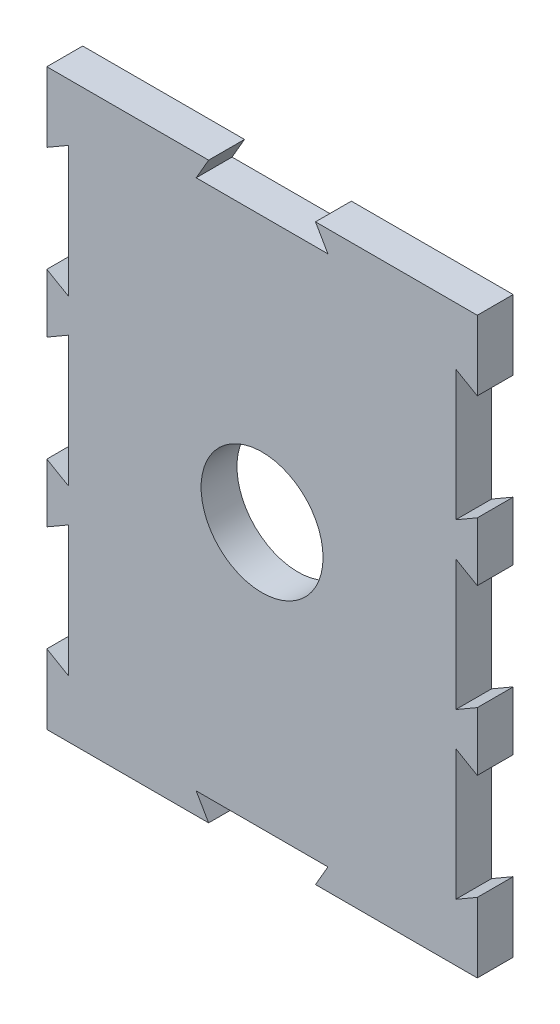
ISO-10303-21;
HEADER;
FILE_DESCRIPTION(('STEP AP214'),'2;1');
FILE_NAME('part.step','',(''),(''),'','','');
FILE_SCHEMA(('AUTOMOTIVE_DESIGN { 1 0 10303 214 1 1 1 1 }'));
ENDSEC;
DATA;
#1=APPLICATION_CONTEXT('core data for automotive mechanical design processes');
#2=APPLICATION_PROTOCOL_DEFINITION('international standard','automotive_design',2000,#1);
#3=PRODUCT_CONTEXT('',#1,'mechanical');
#4=PRODUCT('Part','Part','',(#3));
#5=PRODUCT_RELATED_PRODUCT_CATEGORY('part','',(#4));
#6=PRODUCT_DEFINITION_FORMATION('','',#4);
#7=PRODUCT_DEFINITION_CONTEXT('part definition',#1,'design');
#8=PRODUCT_DEFINITION('design','',#6,#7);
#9=PRODUCT_DEFINITION_SHAPE('','',#8);
#10=(LENGTH_UNIT() NAMED_UNIT(*) SI_UNIT(.MILLI.,.METRE.));
#11=(NAMED_UNIT(*) PLANE_ANGLE_UNIT() SI_UNIT($,.RADIAN.));
#12=(NAMED_UNIT(*) SI_UNIT($,.STERADIAN.) SOLID_ANGLE_UNIT());
#13=UNCERTAINTY_MEASURE_WITH_UNIT(LENGTH_MEASURE(1.E-05),#10,'distance_accuracy_value','');
#14=(GEOMETRIC_REPRESENTATION_CONTEXT(3) GLOBAL_UNCERTAINTY_ASSIGNED_CONTEXT((#13)) GLOBAL_UNIT_ASSIGNED_CONTEXT((#10,
#11,#12)) REPRESENTATION_CONTEXT('',''));
#15=CARTESIAN_POINT('',(0.,0.,0.));
#16=DIRECTION('',(0.,0.,1.));
#17=DIRECTION('',(1.,0.,0.));
#18=AXIS2_PLACEMENT_3D('',#15,#16,#17);
#19=CARTESIAN_POINT('',(22.9063719300984,-13.225,5.));
#20=DIRECTION('',(-0.866025403784439,0.5,0.));
#21=DIRECTION('',(-0.5,-0.866025403784439,0.));
#22=AXIS2_PLACEMENT_3D('',#19,#20,#21);
#23=PLANE('',#22);
#24=DIRECTION('',(0.5,0.866025403784439,0.));
#25=VECTOR('',#24,1.);
#26=CARTESIAN_POINT('',(22.9063719300984,-13.225,0.));
#27=LINE('',#26,#25);
#28=CARTESIAN_POINT('',(7.44781847254617,-40.,0.));
#29=VERTEX_POINT('',#28);
#30=CARTESIAN_POINT('',(9.17986928011505,-37.,0.));
#31=VERTEX_POINT('',#30);
#32=EDGE_CURVE('E309',#29,#31,#27,.T.);
#33=ORIENTED_EDGE('',*,*,#32,.F.);
#34=DIRECTION('',(0.,0.,-1.));
#35=VECTOR('',#34,1.);
#36=CARTESIAN_POINT('',(7.44781847254617,-40.,5.));
#37=LINE('',#36,#35);
#38=CARTESIAN_POINT('',(7.44781847254617,-40.,5.));
#39=VERTEX_POINT('',#38);
#40=EDGE_CURVE('E11',#39,#29,#37,.T.);
#41=ORIENTED_EDGE('',*,*,#40,.F.);
#42=DIRECTION('',(0.5,0.866025403784439,0.));
#43=VECTOR('',#42,1.);
#44=CARTESIAN_POINT('',(22.9063719300984,-13.225,5.));
#45=LINE('',#44,#43);
#46=CARTESIAN_POINT('',(9.17986928011505,-37.,5.));
#47=VERTEX_POINT('',#46);
#48=EDGE_CURVE('E892',#39,#47,#45,.T.);
#49=ORIENTED_EDGE('',*,*,#48,.T.);
#50=DIRECTION('',(0.,0.,-1.));
#51=VECTOR('',#50,1.);
#52=CARTESIAN_POINT('',(9.17986928011505,-37.,5.));
#53=LINE('',#52,#51);
#54=EDGE_CURVE('E58',#47,#31,#53,.T.);
#55=ORIENTED_EDGE('',*,*,#54,.T.);
#56=EDGE_LOOP('',(#33,#41,#49,#55));
#57=FACE_BOUND('',#56,.T.);
#58=ADVANCED_FACE('F41',(#57),#23,.T.);
#59=CARTESIAN_POINT('',(0.,-40.,5.));
#60=DIRECTION('',(0.,-1.,0.));
#61=DIRECTION('',(0.,0.,-1.));
#62=AXIS2_PLACEMENT_3D('',#59,#60,#61);
#63=PLANE('',#62);
#64=DIRECTION('',(-1.,0.,0.));
#65=VECTOR('',#64,1.);
#66=CARTESIAN_POINT('',(0.,-40.,0.));
#67=LINE('',#66,#65);
#68=CARTESIAN_POINT('',(30.,-40.,0.));
#69=VERTEX_POINT('',#68);
#70=EDGE_CURVE('E311',#69,#29,#67,.T.);
#71=ORIENTED_EDGE('',*,*,#70,.F.);
#72=DIRECTION('',(0.,0.,-1.));
#73=VECTOR('',#72,1.);
#74=CARTESIAN_POINT('',(30.,-40.,5.));
#75=LINE('',#74,#73);
#76=CARTESIAN_POINT('',(30.,-40.,5.));
#77=VERTEX_POINT('',#76);
#78=EDGE_CURVE('E50',#77,#69,#75,.T.);
#79=ORIENTED_EDGE('',*,*,#78,.F.);
#80=DIRECTION('',(-1.,0.,0.));
#81=VECTOR('',#80,1.);
#82=CARTESIAN_POINT('',(0.,-40.,5.));
#83=LINE('',#82,#81);
#84=EDGE_CURVE('E297',#77,#39,#83,.T.);
#85=ORIENTED_EDGE('',*,*,#84,.T.);
#86=ORIENTED_EDGE('',*,*,#40,.T.);
#87=EDGE_LOOP('',(#71,#79,#85,#86));
#88=FACE_BOUND('',#87,.T.);
#89=ADVANCED_FACE('F491',(#88),#63,.T.);
#90=CARTESIAN_POINT('',(30.,0.,5.));
#91=DIRECTION('',(-1.,0.,0.));
#92=DIRECTION('',(0.,0.,1.));
#93=AXIS2_PLACEMENT_3D('',#90,#91,#92);
#94=PLANE('',#93);
#95=DIRECTION('',(0.,1.,0.));
#96=VECTOR('',#95,1.);
#97=CARTESIAN_POINT('',(30.,0.,0.));
#98=LINE('',#97,#96);
#99=CARTESIAN_POINT('',(30.,-30.2679491924311,0.));
#100=VERTEX_POINT('',#99);
#101=EDGE_CURVE('E314',#69,#100,#98,.T.);
#102=ORIENTED_EDGE('',*,*,#101,.T.);
#103=DIRECTION('',(0.,0.,-1.));
#104=VECTOR('',#103,1.);
#105=CARTESIAN_POINT('',(30.,-30.2679491924311,5.));
#106=LINE('',#105,#104);
#107=CARTESIAN_POINT('',(30.,-30.2679491924311,5.));
#108=VERTEX_POINT('',#107);
#109=EDGE_CURVE('E476',#108,#100,#106,.T.);
#110=ORIENTED_EDGE('',*,*,#109,.F.);
#111=DIRECTION('',(0.,1.,0.));
#112=VECTOR('',#111,1.);
#113=CARTESIAN_POINT('',(30.,0.,5.));
#114=LINE('',#113,#112);
#115=EDGE_CURVE('E484',#77,#108,#114,.T.);
#116=ORIENTED_EDGE('',*,*,#115,.F.);
#117=ORIENTED_EDGE('',*,*,#78,.T.);
#118=EDGE_LOOP('',(#102,#110,#116,#117));
#119=FACE_BOUND('',#118,.T.);
#120=ADVANCED_FACE('F481',(#119),#94,.F.);
#121=CARTESIAN_POINT('',(20.606406460551,-35.6913429510899,5.));
#122=DIRECTION('',(0.5,-0.866025403784439,0.));
#123=DIRECTION('',(0.866025403784439,0.5,0.));
#124=AXIS2_PLACEMENT_3D('',#121,#122,#123);
#125=PLANE('',#124);
#126=DIRECTION('',(-0.866025403784439,-0.5,0.));
#127=VECTOR('',#126,1.);
#128=CARTESIAN_POINT('',(20.606406460551,-35.6913429510899,0.));
#129=LINE('',#128,#127);
#130=CARTESIAN_POINT('',(27.,-32.,0.));
#131=VERTEX_POINT('',#130);
#132=EDGE_CURVE('E317',#100,#131,#129,.T.);
#133=ORIENTED_EDGE('',*,*,#132,.T.);
#134=DIRECTION('',(0.,0.,-1.));
#135=VECTOR('',#134,1.);
#136=CARTESIAN_POINT('',(27.,-32.,5.));
#137=LINE('',#136,#135);
#138=CARTESIAN_POINT('',(27.,-32.,5.));
#139=VERTEX_POINT('',#138);
#140=EDGE_CURVE('E473',#139,#131,#137,.T.);
#141=ORIENTED_EDGE('',*,*,#140,.F.);
#142=DIRECTION('',(-0.866025403784439,-0.5,0.));
#143=VECTOR('',#142,1.);
#144=CARTESIAN_POINT('',(20.606406460551,-35.6913429510899,5.));
#145=LINE('',#144,#143);
#146=EDGE_CURVE('E889',#108,#139,#145,.T.);
#147=ORIENTED_EDGE('',*,*,#146,.F.);
#148=ORIENTED_EDGE('',*,*,#109,.T.);
#149=EDGE_LOOP('',(#133,#141,#147,#148));
#150=FACE_BOUND('',#149,.T.);
#151=ADVANCED_FACE('F510',(#150),#125,.F.);
#152=CARTESIAN_POINT('',(27.,0.,5.));
#153=DIRECTION('',(-1.,0.,0.));
#154=DIRECTION('',(0.,-1.,0.));
#155=AXIS2_PLACEMENT_3D('',#152,#153,#154);
#156=PLANE('',#155);
#157=DIRECTION('',(0.,1.,0.));
#158=VECTOR('',#157,1.);
#159=CARTESIAN_POINT('',(27.,0.,0.));
#160=LINE('',#159,#158);
#161=CARTESIAN_POINT('',(27.,-13.8134665205268,0.));
#162=VERTEX_POINT('',#161);
#163=EDGE_CURVE('E322',#131,#162,#160,.T.);
#164=ORIENTED_EDGE('',*,*,#163,.T.);
#165=DIRECTION('',(0.,0.,-1.));
#166=VECTOR('',#165,1.);
#167=CARTESIAN_POINT('',(27.,-13.8134665205268,5.));
#168=LINE('',#167,#166);
#169=CARTESIAN_POINT('',(27.,-13.8134665205268,5.));
#170=VERTEX_POINT('',#169);
#171=EDGE_CURVE('E470',#170,#162,#168,.T.);
#172=ORIENTED_EDGE('',*,*,#171,.F.);
#173=DIRECTION('',(0.,1.,0.));
#174=VECTOR('',#173,1.);
#175=CARTESIAN_POINT('',(27.,0.,5.));
#176=LINE('',#175,#174);
#177=EDGE_CURVE('E891',#139,#170,#176,.T.);
#178=ORIENTED_EDGE('',*,*,#177,.F.);
#179=ORIENTED_EDGE('',*,*,#140,.T.);
#180=EDGE_LOOP('',(#164,#172,#178,#179));
#181=FACE_BOUND('',#180,.T.);
#182=ADVANCED_FACE('F513',(#181),#156,.F.);
#183=CARTESIAN_POINT('',(0.768593539448988,1.33124306069484,5.));
#184=DIRECTION('',(0.5,0.866025403784439,0.));
#185=DIRECTION('',(-0.866025403784439,0.5,0.));
#186=AXIS2_PLACEMENT_3D('',#183,#184,#185);
#187=PLANE('',#186);
#188=DIRECTION('',(0.866025403784439,-0.5,0.));
#189=VECTOR('',#188,1.);
#190=CARTESIAN_POINT('',(0.768593539448988,1.33124306069484,0.));
#191=LINE('',#190,#189);
#192=CARTESIAN_POINT('',(30.,-15.5455173280957,0.));
#193=VERTEX_POINT('',#192);
#194=EDGE_CURVE('E325',#162,#193,#191,.T.);
#195=ORIENTED_EDGE('',*,*,#194,.T.);
#196=DIRECTION('',(0.,0.,-1.));
#197=VECTOR('',#196,1.);
#198=CARTESIAN_POINT('',(30.,-15.5455173280957,5.));
#199=LINE('',#198,#197);
#200=CARTESIAN_POINT('',(30.,-15.5455173280957,5.));
#201=VERTEX_POINT('',#200);
#202=EDGE_CURVE('E467',#201,#193,#199,.T.);
#203=ORIENTED_EDGE('',*,*,#202,.F.);
#204=DIRECTION('',(0.866025403784439,-0.5,0.));
#205=VECTOR('',#204,1.);
#206=CARTESIAN_POINT('',(0.768593539448988,1.33124306069484,5.));
#207=LINE('',#206,#205);
#208=EDGE_CURVE('E895',#170,#201,#207,.T.);
#209=ORIENTED_EDGE('',*,*,#208,.F.);
#210=ORIENTED_EDGE('',*,*,#171,.T.);
#211=EDGE_LOOP('',(#195,#203,#209,#210));
#212=FACE_BOUND('',#211,.T.);
#213=ADVANCED_FACE('F517',(#212),#187,.F.);
#214=CARTESIAN_POINT('',(30.,-7.36121593216774,0.));
#215=VERTEX_POINT('',#214);
#216=EDGE_CURVE('E319',#193,#215,#98,.T.);
#217=ORIENTED_EDGE('',*,*,#216,.T.);
#218=DIRECTION('',(0.,0.,-1.));
#219=VECTOR('',#218,1.);
#220=CARTESIAN_POINT('',(30.,-7.36121593216774,5.));
#221=LINE('',#220,#219);
#222=CARTESIAN_POINT('',(30.,-7.36121593216774,5.));
#223=VERTEX_POINT('',#222);
#224=EDGE_CURVE('E464',#223,#215,#221,.T.);
#225=ORIENTED_EDGE('',*,*,#224,.F.);
#226=EDGE_CURVE('E888',#201,#223,#114,.T.);
#227=ORIENTED_EDGE('',*,*,#226,.F.);
#228=ORIENTED_EDGE('',*,*,#202,.T.);
#229=EDGE_LOOP('',(#217,#225,#227,#228));
#230=FACE_BOUND('',#229,.T.);
#231=ADVANCED_FACE('F521',(#230),#94,.F.);
#232=CARTESIAN_POINT('',(10.6875,-18.5112930058924,5.));
#233=DIRECTION('',(0.5,-0.866025403784439,0.));
#234=DIRECTION('',(0.866025403784439,0.5,0.));
#235=AXIS2_PLACEMENT_3D('',#232,#233,#234);
#236=PLANE('',#235);
#237=DIRECTION('',(-0.866025403784439,-0.5,0.));
#238=VECTOR('',#237,1.);
#239=CARTESIAN_POINT('',(10.6875,-18.5112930058924,0.));
#240=LINE('',#239,#238);
#241=CARTESIAN_POINT('',(27.,-9.09326673973662,0.));
#242=VERTEX_POINT('',#241);
#243=EDGE_CURVE('E328',#215,#242,#240,.T.);
#244=ORIENTED_EDGE('',*,*,#243,.T.);
#245=DIRECTION('',(0.,0.,-1.));
#246=VECTOR('',#245,1.);
#247=CARTESIAN_POINT('',(27.,-9.09326673973662,5.));
#248=LINE('',#247,#246);
#249=CARTESIAN_POINT('',(27.,-9.09326673973662,5.));
#250=VERTEX_POINT('',#249);
#251=EDGE_CURVE('E461',#250,#242,#248,.T.);
#252=ORIENTED_EDGE('',*,*,#251,.F.);
#253=DIRECTION('',(-0.866025403784439,-0.5,0.));
#254=VECTOR('',#253,1.);
#255=CARTESIAN_POINT('',(10.6875,-18.5112930058924,5.));
#256=LINE('',#255,#254);
#257=EDGE_CURVE('E894',#223,#250,#256,.T.);
#258=ORIENTED_EDGE('',*,*,#257,.F.);
#259=ORIENTED_EDGE('',*,*,#224,.T.);
#260=EDGE_LOOP('',(#244,#252,#258,#259));
#261=FACE_BOUND('',#260,.T.);
#262=ADVANCED_FACE('F523',(#261),#236,.F.);
#263=CARTESIAN_POINT('',(27.,0.,5.));
#264=DIRECTION('',(-1.,0.,0.));
#265=DIRECTION('',(0.,-1.,0.));
#266=AXIS2_PLACEMENT_3D('',#263,#264,#265);
#267=PLANE('',#266);
#268=DIRECTION('',(0.,1.,0.));
#269=VECTOR('',#268,1.);
#270=CARTESIAN_POINT('',(27.,0.,0.));
#271=LINE('',#270,#269);
#272=CARTESIAN_POINT('',(27.,9.0932667397366,0.));
#273=VERTEX_POINT('',#272);
#274=EDGE_CURVE('E331',#242,#273,#271,.T.);
#275=ORIENTED_EDGE('',*,*,#274,.T.);
#276=DIRECTION('',(0.,0.,-1.));
#277=VECTOR('',#276,1.);
#278=CARTESIAN_POINT('',(27.,9.0932667397366,5.));
#279=LINE('',#278,#277);
#280=CARTESIAN_POINT('',(27.,9.0932667397366,5.));
#281=VERTEX_POINT('',#280);
#282=EDGE_CURVE('E458',#281,#273,#279,.T.);
#283=ORIENTED_EDGE('',*,*,#282,.F.);
#284=DIRECTION('',(0.,1.,0.));
#285=VECTOR('',#284,1.);
#286=CARTESIAN_POINT('',(27.,0.,5.));
#287=LINE('',#286,#285);
#288=EDGE_CURVE('E898',#250,#281,#287,.T.);
#289=ORIENTED_EDGE('',*,*,#288,.F.);
#290=ORIENTED_EDGE('',*,*,#251,.T.);
#291=EDGE_LOOP('',(#275,#283,#289,#290));
#292=FACE_BOUND('',#291,.T.);
#293=ADVANCED_FACE('F526',(#292),#267,.F.);
#294=CARTESIAN_POINT('',(10.6875,18.5112930058924,5.));
#295=DIRECTION('',(0.5,0.866025403784439,0.));
#296=DIRECTION('',(-0.866025403784439,0.5,0.));
#297=AXIS2_PLACEMENT_3D('',#294,#295,#296);
#298=PLANE('',#297);
#299=DIRECTION('',(0.866025403784439,-0.5,0.));
#300=VECTOR('',#299,1.);
#301=CARTESIAN_POINT('',(10.6875,18.5112930058924,0.));
#302=LINE('',#301,#300);
#303=CARTESIAN_POINT('',(30.,7.36121593216772,0.));
#304=VERTEX_POINT('',#303);
#305=EDGE_CURVE('E334',#273,#304,#302,.T.);
#306=ORIENTED_EDGE('',*,*,#305,.T.);
#307=DIRECTION('',(0.,0.,-1.));
#308=VECTOR('',#307,1.);
#309=CARTESIAN_POINT('',(30.,7.36121593216772,5.));
#310=LINE('',#309,#308);
#311=CARTESIAN_POINT('',(30.,7.36121593216772,5.));
#312=VERTEX_POINT('',#311);
#313=EDGE_CURVE('E455',#312,#304,#310,.T.);
#314=ORIENTED_EDGE('',*,*,#313,.F.);
#315=DIRECTION('',(0.866025403784439,-0.5,0.));
#316=VECTOR('',#315,1.);
#317=CARTESIAN_POINT('',(10.6875,18.5112930058924,5.));
#318=LINE('',#317,#316);
#319=EDGE_CURVE('E887',#281,#312,#318,.T.);
#320=ORIENTED_EDGE('',*,*,#319,.F.);
#321=ORIENTED_EDGE('',*,*,#282,.T.);
#322=EDGE_LOOP('',(#306,#314,#320,#321));
#323=FACE_BOUND('',#322,.T.);
#324=ADVANCED_FACE('F530',(#323),#298,.F.);
#325=CARTESIAN_POINT('',(30.,15.5455173280956,0.));
#326=VERTEX_POINT('',#325);
#327=EDGE_CURVE('E337',#304,#326,#98,.T.);
#328=ORIENTED_EDGE('',*,*,#327,.T.);
#329=DIRECTION('',(0.,0.,-1.));
#330=VECTOR('',#329,1.);
#331=CARTESIAN_POINT('',(30.,15.5455173280956,5.));
#332=LINE('',#331,#330);
#333=CARTESIAN_POINT('',(30.,15.5455173280956,5.));
#334=VERTEX_POINT('',#333);
#335=EDGE_CURVE('E452',#334,#326,#332,.T.);
#336=ORIENTED_EDGE('',*,*,#335,.F.);
#337=EDGE_CURVE('E881',#312,#334,#114,.T.);
#338=ORIENTED_EDGE('',*,*,#337,.F.);
#339=ORIENTED_EDGE('',*,*,#313,.T.);
#340=EDGE_LOOP('',(#328,#336,#338,#339));
#341=FACE_BOUND('',#340,.T.);
#342=ADVANCED_FACE('F534',(#341),#94,.F.);
#343=CARTESIAN_POINT('',(0.768593539448999,-1.33124306069486,5.));
#344=DIRECTION('',(0.5,-0.866025403784439,0.));
#345=DIRECTION('',(0.866025403784439,0.5,0.));
#346=AXIS2_PLACEMENT_3D('',#343,#344,#345);
#347=PLANE('',#346);
#348=DIRECTION('',(-0.866025403784439,-0.5,0.));
#349=VECTOR('',#348,1.);
#350=CARTESIAN_POINT('',(0.768593539448999,-1.33124306069486,0.));
#351=LINE('',#350,#349);
#352=CARTESIAN_POINT('',(27.,13.8134665205267,0.));
#353=VERTEX_POINT('',#352);
#354=EDGE_CURVE('E338',#326,#353,#351,.T.);
#355=ORIENTED_EDGE('',*,*,#354,.T.);
#356=DIRECTION('',(0.,0.,-1.));
#357=VECTOR('',#356,1.);
#358=CARTESIAN_POINT('',(27.,13.8134665205267,5.));
#359=LINE('',#358,#357);
#360=CARTESIAN_POINT('',(27.,13.8134665205267,5.));
#361=VERTEX_POINT('',#360);
#362=EDGE_CURVE('E449',#361,#353,#359,.T.);
#363=ORIENTED_EDGE('',*,*,#362,.F.);
#364=DIRECTION('',(-0.866025403784439,-0.5,0.));
#365=VECTOR('',#364,1.);
#366=CARTESIAN_POINT('',(0.768593539448999,-1.33124306069486,5.));
#367=LINE('',#366,#365);
#368=EDGE_CURVE('E886',#334,#361,#367,.T.);
#369=ORIENTED_EDGE('',*,*,#368,.F.);
#370=ORIENTED_EDGE('',*,*,#335,.T.);
#371=EDGE_LOOP('',(#355,#363,#369,#370));
#372=FACE_BOUND('',#371,.T.);
#373=ADVANCED_FACE('F536',(#372),#347,.F.);
#374=CARTESIAN_POINT('',(27.,0.,5.));
#375=DIRECTION('',(-1.,0.,0.));
#376=DIRECTION('',(0.,-1.,0.));
#377=AXIS2_PLACEMENT_3D('',#374,#375,#376);
#378=PLANE('',#377);
#379=DIRECTION('',(0.,1.,0.));
#380=VECTOR('',#379,1.);
#381=CARTESIAN_POINT('',(27.,0.,0.));
#382=LINE('',#381,#380);
#383=CARTESIAN_POINT('',(27.,32.,0.));
#384=VERTEX_POINT('',#383);
#385=EDGE_CURVE('E341',#353,#384,#382,.T.);
#386=ORIENTED_EDGE('',*,*,#385,.T.);
#387=DIRECTION('',(0.,0.,-1.));
#388=VECTOR('',#387,1.);
#389=CARTESIAN_POINT('',(27.,32.,5.));
#390=LINE('',#389,#388);
#391=CARTESIAN_POINT('',(27.,32.,5.));
#392=VERTEX_POINT('',#391);
#393=EDGE_CURVE('E446',#392,#384,#390,.T.);
#394=ORIENTED_EDGE('',*,*,#393,.F.);
#395=DIRECTION('',(0.,1.,0.));
#396=VECTOR('',#395,1.);
#397=CARTESIAN_POINT('',(27.,0.,5.));
#398=LINE('',#397,#396);
#399=EDGE_CURVE('E882',#361,#392,#398,.T.);
#400=ORIENTED_EDGE('',*,*,#399,.F.);
#401=ORIENTED_EDGE('',*,*,#362,.T.);
#402=EDGE_LOOP('',(#386,#394,#400,#401));
#403=FACE_BOUND('',#402,.T.);
#404=ADVANCED_FACE('F539',(#403),#378,.F.);
#405=CARTESIAN_POINT('',(20.6064064605511,35.6913429510899,5.));
#406=DIRECTION('',(0.500000000000001,0.866025403784438,0.));
#407=DIRECTION('',(-0.866025403784438,0.500000000000001,0.));
#408=AXIS2_PLACEMENT_3D('',#405,#406,#407);
#409=PLANE('',#408);
#410=DIRECTION('',(0.866025403784438,-0.500000000000001,0.));
#411=VECTOR('',#410,1.);
#412=CARTESIAN_POINT('',(20.6064064605511,35.6913429510899,0.));
#413=LINE('',#412,#411);
#414=CARTESIAN_POINT('',(30.,30.2679491924311,0.));
#415=VERTEX_POINT('',#414);
#416=EDGE_CURVE('E344',#384,#415,#413,.T.);
#417=ORIENTED_EDGE('',*,*,#416,.T.);
#418=DIRECTION('',(0.,0.,-1.));
#419=VECTOR('',#418,1.);
#420=CARTESIAN_POINT('',(30.,30.2679491924311,5.));
#421=LINE('',#420,#419);
#422=CARTESIAN_POINT('',(30.,30.2679491924311,5.));
#423=VERTEX_POINT('',#422);
#424=EDGE_CURVE('E443',#423,#415,#421,.T.);
#425=ORIENTED_EDGE('',*,*,#424,.F.);
#426=DIRECTION('',(0.866025403784438,-0.500000000000001,0.));
#427=VECTOR('',#426,1.);
#428=CARTESIAN_POINT('',(20.6064064605511,35.6913429510899,5.));
#429=LINE('',#428,#427);
#430=EDGE_CURVE('E879',#392,#423,#429,.T.);
#431=ORIENTED_EDGE('',*,*,#430,.F.);
#432=ORIENTED_EDGE('',*,*,#393,.T.);
#433=EDGE_LOOP('',(#417,#425,#431,#432));
#434=FACE_BOUND('',#433,.T.);
#435=ADVANCED_FACE('F543',(#434),#409,.F.);
#436=CARTESIAN_POINT('',(30.,40.,0.));
#437=VERTEX_POINT('',#436);
#438=EDGE_CURVE('E318',#415,#437,#98,.T.);
#439=ORIENTED_EDGE('',*,*,#438,.T.);
#440=DIRECTION('',(0.,0.,-1.));
#441=VECTOR('',#440,1.);
#442=CARTESIAN_POINT('',(30.,40.,5.));
#443=LINE('',#442,#441);
#444=CARTESIAN_POINT('',(30.,40.,5.));
#445=VERTEX_POINT('',#444);
#446=EDGE_CURVE('E440',#445,#437,#443,.T.);
#447=ORIENTED_EDGE('',*,*,#446,.F.);
#448=EDGE_CURVE('E874',#423,#445,#114,.T.);
#449=ORIENTED_EDGE('',*,*,#448,.F.);
#450=ORIENTED_EDGE('',*,*,#424,.T.);
#451=EDGE_LOOP('',(#439,#447,#449,#450));
#452=FACE_BOUND('',#451,.T.);
#453=ADVANCED_FACE('F547',(#452),#94,.F.);
#454=CARTESIAN_POINT('',(0.,40.,5.));
#455=DIRECTION('',(0.,-1.,0.));
#456=DIRECTION('',(1.,0.,0.));
#457=AXIS2_PLACEMENT_3D('',#454,#455,#456);
#458=PLANE('',#457);
#459=DIRECTION('',(-1.,0.,0.));
#460=VECTOR('',#459,1.);
#461=CARTESIAN_POINT('',(0.,40.,0.));
#462=LINE('',#461,#460);
#463=CARTESIAN_POINT('',(7.44781847254617,40.,0.));
#464=VERTEX_POINT('',#463);
#465=EDGE_CURVE('E347',#437,#464,#462,.T.);
#466=ORIENTED_EDGE('',*,*,#465,.T.);
#467=DIRECTION('',(0.,0.,-1.));
#468=VECTOR('',#467,1.);
#469=CARTESIAN_POINT('',(7.44781847254617,40.,5.));
#470=LINE('',#469,#468);
#471=CARTESIAN_POINT('',(7.44781847254617,40.,5.));
#472=VERTEX_POINT('',#471);
#473=EDGE_CURVE('E437',#472,#464,#470,.T.);
#474=ORIENTED_EDGE('',*,*,#473,.F.);
#475=DIRECTION('',(-1.,0.,0.));
#476=VECTOR('',#475,1.);
#477=CARTESIAN_POINT('',(0.,40.,5.));
#478=LINE('',#477,#476);
#479=EDGE_CURVE('E870',#445,#472,#478,.T.);
#480=ORIENTED_EDGE('',*,*,#479,.F.);
#481=ORIENTED_EDGE('',*,*,#446,.T.);
#482=EDGE_LOOP('',(#466,#474,#480,#481));
#483=FACE_BOUND('',#482,.T.);
#484=ADVANCED_FACE('F551',(#483),#458,.F.);
#485=CARTESIAN_POINT('',(22.9063719300984,13.225,5.));
#486=DIRECTION('',(0.866025403784439,0.5,0.));
#487=DIRECTION('',(-0.5,0.866025403784439,0.));
#488=AXIS2_PLACEMENT_3D('',#485,#486,#487);
#489=PLANE('',#488);
#490=DIRECTION('',(0.5,-0.866025403784439,0.));
#491=VECTOR('',#490,1.);
#492=CARTESIAN_POINT('',(22.9063719300984,13.225,0.));
#493=LINE('',#492,#491);
#494=CARTESIAN_POINT('',(9.17986928011505,37.,0.));
#495=VERTEX_POINT('',#494);
#496=EDGE_CURVE('E350',#464,#495,#493,.T.);
#497=ORIENTED_EDGE('',*,*,#496,.T.);
#498=DIRECTION('',(0.,0.,-1.));
#499=VECTOR('',#498,1.);
#500=CARTESIAN_POINT('',(9.17986928011505,37.,5.));
#501=LINE('',#500,#499);
#502=CARTESIAN_POINT('',(9.17986928011505,37.,5.));
#503=VERTEX_POINT('',#502);
#504=EDGE_CURVE('E434',#503,#495,#501,.T.);
#505=ORIENTED_EDGE('',*,*,#504,.F.);
#506=DIRECTION('',(0.5,-0.866025403784439,0.));
#507=VECTOR('',#506,1.);
#508=CARTESIAN_POINT('',(22.9063719300984,13.225,5.));
#509=LINE('',#508,#507);
#510=EDGE_CURVE('E873',#472,#503,#509,.T.);
#511=ORIENTED_EDGE('',*,*,#510,.F.);
#512=ORIENTED_EDGE('',*,*,#473,.T.);
#513=EDGE_LOOP('',(#497,#505,#511,#512));
#514=FACE_BOUND('',#513,.T.);
#515=ADVANCED_FACE('F553',(#514),#489,.F.);
#516=CARTESIAN_POINT('',(0.,37.,5.));
#517=DIRECTION('',(0.,-1.,0.));
#518=DIRECTION('',(0.,0.,-1.));
#519=AXIS2_PLACEMENT_3D('',#516,#517,#518);
#520=PLANE('',#519);
#521=DIRECTION('',(-1.,0.,0.));
#522=VECTOR('',#521,1.);
#523=CARTESIAN_POINT('',(0.,37.,0.));
#524=LINE('',#523,#522);
#525=CARTESIAN_POINT('',(-9.17986928011505,37.,0.));
#526=VERTEX_POINT('',#525);
#527=EDGE_CURVE('E354',#495,#526,#524,.T.);
#528=ORIENTED_EDGE('',*,*,#527,.T.);
#529=DIRECTION('',(0.,0.,-1.));
#530=VECTOR('',#529,1.);
#531=CARTESIAN_POINT('',(-9.17986928011505,37.,5.));
#532=LINE('',#531,#530);
#533=CARTESIAN_POINT('',(-9.17986928011505,37.,5.));
#534=VERTEX_POINT('',#533);
#535=EDGE_CURVE('E431',#534,#526,#532,.T.);
#536=ORIENTED_EDGE('',*,*,#535,.F.);
#537=DIRECTION('',(-1.,0.,0.));
#538=VECTOR('',#537,1.);
#539=CARTESIAN_POINT('',(0.,37.,5.));
#540=LINE('',#539,#538);
#541=EDGE_CURVE('E912',#503,#534,#540,.T.);
#542=ORIENTED_EDGE('',*,*,#541,.F.);
#543=ORIENTED_EDGE('',*,*,#504,.T.);
#544=EDGE_LOOP('',(#528,#536,#542,#543));
#545=FACE_BOUND('',#544,.T.);
#546=ADVANCED_FACE('F556',(#545),#520,.F.);
#547=CARTESIAN_POINT('',(-22.9063719300984,13.225,5.));
#548=DIRECTION('',(-0.866025403784439,0.5,0.));
#549=DIRECTION('',(-0.5,-0.866025403784439,0.));
#550=AXIS2_PLACEMENT_3D('',#547,#548,#549);
#551=PLANE('',#550);
#552=DIRECTION('',(0.5,0.866025403784439,0.));
#553=VECTOR('',#552,1.);
#554=CARTESIAN_POINT('',(-22.9063719300984,13.225,0.));
#555=LINE('',#554,#553);
#556=CARTESIAN_POINT('',(-7.44781847254616,40.,0.));
#557=VERTEX_POINT('',#556);
#558=EDGE_CURVE('E357',#526,#557,#555,.T.);
#559=ORIENTED_EDGE('',*,*,#558,.T.);
#560=DIRECTION('',(0.,0.,-1.));
#561=VECTOR('',#560,1.);
#562=CARTESIAN_POINT('',(-7.44781847254616,40.,5.));
#563=LINE('',#562,#561);
#564=CARTESIAN_POINT('',(-7.44781847254616,40.,5.));
#565=VERTEX_POINT('',#564);
#566=EDGE_CURVE('E428',#565,#557,#563,.T.);
#567=ORIENTED_EDGE('',*,*,#566,.F.);
#568=DIRECTION('',(0.5,0.866025403784439,0.));
#569=VECTOR('',#568,1.);
#570=CARTESIAN_POINT('',(-22.9063719300984,13.225,5.));
#571=LINE('',#570,#569);
#572=EDGE_CURVE('E915',#534,#565,#571,.T.);
#573=ORIENTED_EDGE('',*,*,#572,.F.);
#574=ORIENTED_EDGE('',*,*,#535,.T.);
#575=EDGE_LOOP('',(#559,#567,#573,#574));
#576=FACE_BOUND('',#575,.T.);
#577=ADVANCED_FACE('F560',(#576),#551,.F.);
#578=CARTESIAN_POINT('',(-30.,40.,0.));
#579=VERTEX_POINT('',#578);
#580=EDGE_CURVE('E351',#557,#579,#462,.T.);
#581=ORIENTED_EDGE('',*,*,#580,.T.);
#582=DIRECTION('',(0.,0.,-1.));
#583=VECTOR('',#582,1.);
#584=CARTESIAN_POINT('',(-30.,40.,5.));
#585=LINE('',#584,#583);
#586=CARTESIAN_POINT('',(-30.,40.,5.));
#587=VERTEX_POINT('',#586);
#588=EDGE_CURVE('E426',#587,#579,#585,.T.);
#589=ORIENTED_EDGE('',*,*,#588,.F.);
#590=EDGE_CURVE('E876',#565,#587,#478,.T.);
#591=ORIENTED_EDGE('',*,*,#590,.F.);
#592=ORIENTED_EDGE('',*,*,#566,.T.);
#593=EDGE_LOOP('',(#581,#589,#591,#592));
#594=FACE_BOUND('',#593,.T.);
#595=ADVANCED_FACE('F564',(#594),#458,.F.);
#596=CARTESIAN_POINT('',(-30.,0.,5.));
#597=DIRECTION('',(-1.,0.,0.));
#598=DIRECTION('',(0.,0.,1.));
#599=AXIS2_PLACEMENT_3D('',#596,#597,#598);
#600=PLANE('',#599);
#601=DIRECTION('',(0.,1.,0.));
#602=VECTOR('',#601,1.);
#603=CARTESIAN_POINT('',(-30.,0.,0.));
#604=LINE('',#603,#602);
#605=CARTESIAN_POINT('',(-30.,30.2679491924311,0.));
#606=VERTEX_POINT('',#605);
#607=EDGE_CURVE('E360',#606,#579,#604,.T.);
#608=ORIENTED_EDGE('',*,*,#607,.F.);
#609=DIRECTION('',(0.,0.,-1.));
#610=VECTOR('',#609,1.);
#611=CARTESIAN_POINT('',(-30.,30.2679491924311,5.));
#612=LINE('',#611,#610);
#613=CARTESIAN_POINT('',(-30.,30.2679491924311,5.));
#614=VERTEX_POINT('',#613);
#615=EDGE_CURVE('E424',#614,#606,#612,.T.);
#616=ORIENTED_EDGE('',*,*,#615,.F.);
#617=DIRECTION('',(0.,1.,0.));
#618=VECTOR('',#617,1.);
#619=CARTESIAN_POINT('',(-30.,0.,5.));
#620=LINE('',#619,#618);
#621=EDGE_CURVE('E918',#614,#587,#620,.T.);
#622=ORIENTED_EDGE('',*,*,#621,.T.);
#623=ORIENTED_EDGE('',*,*,#588,.T.);
#624=EDGE_LOOP('',(#608,#616,#622,#623));
#625=FACE_BOUND('',#624,.T.);
#626=ADVANCED_FACE('F568',(#625),#600,.T.);
#627=CARTESIAN_POINT('',(-20.6064064605511,35.6913429510899,5.));
#628=DIRECTION('',(0.500000000000001,-0.866025403784438,0.));
#629=DIRECTION('',(0.866025403784438,0.500000000000001,0.));
#630=AXIS2_PLACEMENT_3D('',#627,#628,#629);
#631=PLANE('',#630);
#632=DIRECTION('',(-0.866025403784438,-0.500000000000001,0.));
#633=VECTOR('',#632,1.);
#634=CARTESIAN_POINT('',(-20.6064064605511,35.6913429510899,0.));
#635=LINE('',#634,#633);
#636=CARTESIAN_POINT('',(-27.,32.,0.));
#637=VERTEX_POINT('',#636);
#638=EDGE_CURVE('E363',#637,#606,#635,.T.);
#639=ORIENTED_EDGE('',*,*,#638,.F.);
#640=DIRECTION('',(0.,0.,-1.));
#641=VECTOR('',#640,1.);
#642=CARTESIAN_POINT('',(-27.,32.,5.));
#643=LINE('',#642,#641);
#644=CARTESIAN_POINT('',(-27.,32.,5.));
#645=VERTEX_POINT('',#644);
#646=EDGE_CURVE('E422',#645,#637,#643,.T.);
#647=ORIENTED_EDGE('',*,*,#646,.F.);
#648=DIRECTION('',(-0.866025403784438,-0.500000000000001,0.));
#649=VECTOR('',#648,1.);
#650=CARTESIAN_POINT('',(-20.6064064605511,35.6913429510899,5.));
#651=LINE('',#650,#649);
#652=EDGE_CURVE('E921',#645,#614,#651,.T.);
#653=ORIENTED_EDGE('',*,*,#652,.T.);
#654=ORIENTED_EDGE('',*,*,#615,.T.);
#655=EDGE_LOOP('',(#639,#647,#653,#654));
#656=FACE_BOUND('',#655,.T.);
#657=ADVANCED_FACE('F570',(#656),#631,.T.);
#658=CARTESIAN_POINT('',(-27.,0.,5.));
#659=DIRECTION('',(-1.,0.,0.));
#660=DIRECTION('',(0.,-1.,0.));
#661=AXIS2_PLACEMENT_3D('',#658,#659,#660);
#662=PLANE('',#661);
#663=DIRECTION('',(0.,1.,0.));
#664=VECTOR('',#663,1.);
#665=CARTESIAN_POINT('',(-27.,0.,0.));
#666=LINE('',#665,#664);
#667=CARTESIAN_POINT('',(-27.,13.8134665205268,0.));
#668=VERTEX_POINT('',#667);
#669=EDGE_CURVE('E368',#668,#637,#666,.T.);
#670=ORIENTED_EDGE('',*,*,#669,.F.);
#671=DIRECTION('',(0.,0.,-1.));
#672=VECTOR('',#671,1.);
#673=CARTESIAN_POINT('',(-27.,13.8134665205268,5.));
#674=LINE('',#673,#672);
#675=CARTESIAN_POINT('',(-27.,13.8134665205268,5.));
#676=VERTEX_POINT('',#675);
#677=EDGE_CURVE('E420',#676,#668,#674,.T.);
#678=ORIENTED_EDGE('',*,*,#677,.F.);
#679=DIRECTION('',(0.,1.,0.));
#680=VECTOR('',#679,1.);
#681=CARTESIAN_POINT('',(-27.,0.,5.));
#682=LINE('',#681,#680);
#683=EDGE_CURVE('E925',#676,#645,#682,.T.);
#684=ORIENTED_EDGE('',*,*,#683,.T.);
#685=ORIENTED_EDGE('',*,*,#646,.T.);
#686=EDGE_LOOP('',(#670,#678,#684,#685));
#687=FACE_BOUND('',#686,.T.);
#688=ADVANCED_FACE('F573',(#687),#662,.T.);
#689=CARTESIAN_POINT('',(-0.768593539448999,-1.33124306069486,5.));
#690=DIRECTION('',(0.5,0.866025403784439,0.));
#691=DIRECTION('',(-0.866025403784439,0.5,0.));
#692=AXIS2_PLACEMENT_3D('',#689,#690,#691);
#693=PLANE('',#692);
#694=DIRECTION('',(0.866025403784439,-0.5,0.));
#695=VECTOR('',#694,1.);
#696=CARTESIAN_POINT('',(-0.768593539448999,-1.33124306069486,0.));
#697=LINE('',#696,#695);
#698=CARTESIAN_POINT('',(-30.,15.5455173280956,0.));
#699=VERTEX_POINT('',#698);
#700=EDGE_CURVE('E371',#699,#668,#697,.T.);
#701=ORIENTED_EDGE('',*,*,#700,.F.);
#702=DIRECTION('',(0.,0.,-1.));
#703=VECTOR('',#702,1.);
#704=CARTESIAN_POINT('',(-30.,15.5455173280956,5.));
#705=LINE('',#704,#703);
#706=CARTESIAN_POINT('',(-30.,15.5455173280956,5.));
#707=VERTEX_POINT('',#706);
#708=EDGE_CURVE('E418',#707,#699,#705,.T.);
#709=ORIENTED_EDGE('',*,*,#708,.F.);
#710=DIRECTION('',(0.866025403784439,-0.5,0.));
#711=VECTOR('',#710,1.);
#712=CARTESIAN_POINT('',(-0.768593539448999,-1.33124306069486,5.));
#713=LINE('',#712,#711);
#714=EDGE_CURVE('E928',#707,#676,#713,.T.);
#715=ORIENTED_EDGE('',*,*,#714,.T.);
#716=ORIENTED_EDGE('',*,*,#677,.T.);
#717=EDGE_LOOP('',(#701,#709,#715,#716));
#718=FACE_BOUND('',#717,.T.);
#719=ADVANCED_FACE('F577',(#718),#693,.T.);
#720=CARTESIAN_POINT('',(-30.,7.36121593216772,0.));
#721=VERTEX_POINT('',#720);
#722=EDGE_CURVE('E365',#721,#699,#604,.T.);
#723=ORIENTED_EDGE('',*,*,#722,.F.);
#724=DIRECTION('',(0.,0.,-1.));
#725=VECTOR('',#724,1.);
#726=CARTESIAN_POINT('',(-30.,7.36121593216772,5.));
#727=LINE('',#726,#725);
#728=CARTESIAN_POINT('',(-30.,7.36121593216772,5.));
#729=VERTEX_POINT('',#728);
#730=EDGE_CURVE('E416',#729,#721,#727,.T.);
#731=ORIENTED_EDGE('',*,*,#730,.F.);
#732=EDGE_CURVE('E922',#729,#707,#620,.T.);
#733=ORIENTED_EDGE('',*,*,#732,.T.);
#734=ORIENTED_EDGE('',*,*,#708,.T.);
#735=EDGE_LOOP('',(#723,#731,#733,#734));
#736=FACE_BOUND('',#735,.T.);
#737=ADVANCED_FACE('F581',(#736),#600,.T.);
#738=CARTESIAN_POINT('',(-10.6875,18.5112930058924,5.));
#739=DIRECTION('',(0.5,-0.866025403784439,0.));
#740=DIRECTION('',(0.866025403784439,0.5,0.));
#741=AXIS2_PLACEMENT_3D('',#738,#739,#740);
#742=PLANE('',#741);
#743=DIRECTION('',(-0.866025403784439,-0.5,0.));
#744=VECTOR('',#743,1.);
#745=CARTESIAN_POINT('',(-10.6875,18.5112930058924,0.));
#746=LINE('',#745,#744);
#747=CARTESIAN_POINT('',(-27.,9.0932667397366,0.));
#748=VERTEX_POINT('',#747);
#749=EDGE_CURVE('E374',#748,#721,#746,.T.);
#750=ORIENTED_EDGE('',*,*,#749,.F.);
#751=DIRECTION('',(0.,0.,-1.));
#752=VECTOR('',#751,1.);
#753=CARTESIAN_POINT('',(-27.,9.0932667397366,5.));
#754=LINE('',#753,#752);
#755=CARTESIAN_POINT('',(-27.,9.0932667397366,5.));
#756=VERTEX_POINT('',#755);
#757=EDGE_CURVE('E414',#756,#748,#754,.T.);
#758=ORIENTED_EDGE('',*,*,#757,.F.);
#759=DIRECTION('',(-0.866025403784439,-0.5,0.));
#760=VECTOR('',#759,1.);
#761=CARTESIAN_POINT('',(-10.6875,18.5112930058924,5.));
#762=LINE('',#761,#760);
#763=EDGE_CURVE('E931',#756,#729,#762,.T.);
#764=ORIENTED_EDGE('',*,*,#763,.T.);
#765=ORIENTED_EDGE('',*,*,#730,.T.);
#766=EDGE_LOOP('',(#750,#758,#764,#765));
#767=FACE_BOUND('',#766,.T.);
#768=ADVANCED_FACE('F583',(#767),#742,.T.);
#769=CARTESIAN_POINT('',(-27.,0.,5.));
#770=DIRECTION('',(-1.,0.,0.));
#771=DIRECTION('',(0.,-1.,0.));
#772=AXIS2_PLACEMENT_3D('',#769,#770,#771);
#773=PLANE('',#772);
#774=DIRECTION('',(0.,1.,0.));
#775=VECTOR('',#774,1.);
#776=CARTESIAN_POINT('',(-27.,0.,0.));
#777=LINE('',#776,#775);
#778=CARTESIAN_POINT('',(-27.,-9.09326673973662,0.));
#779=VERTEX_POINT('',#778);
#780=EDGE_CURVE('E377',#779,#748,#777,.T.);
#781=ORIENTED_EDGE('',*,*,#780,.F.);
#782=DIRECTION('',(0.,0.,-1.));
#783=VECTOR('',#782,1.);
#784=CARTESIAN_POINT('',(-27.,-9.09326673973662,5.));
#785=LINE('',#784,#783);
#786=CARTESIAN_POINT('',(-27.,-9.09326673973662,5.));
#787=VERTEX_POINT('',#786);
#788=EDGE_CURVE('E412',#787,#779,#785,.T.);
#789=ORIENTED_EDGE('',*,*,#788,.F.);
#790=DIRECTION('',(0.,1.,0.));
#791=VECTOR('',#790,1.);
#792=CARTESIAN_POINT('',(-27.,0.,5.));
#793=LINE('',#792,#791);
#794=EDGE_CURVE('E934',#787,#756,#793,.T.);
#795=ORIENTED_EDGE('',*,*,#794,.T.);
#796=ORIENTED_EDGE('',*,*,#757,.T.);
#797=EDGE_LOOP('',(#781,#789,#795,#796));
#798=FACE_BOUND('',#797,.T.);
#799=ADVANCED_FACE('F586',(#798),#773,.T.);
#800=CARTESIAN_POINT('',(-10.6875,-18.5112930058924,5.));
#801=DIRECTION('',(0.5,0.866025403784439,0.));
#802=DIRECTION('',(-0.866025403784439,0.5,0.));
#803=AXIS2_PLACEMENT_3D('',#800,#801,#802);
#804=PLANE('',#803);
#805=DIRECTION('',(0.866025403784439,-0.5,0.));
#806=VECTOR('',#805,1.);
#807=CARTESIAN_POINT('',(-10.6875,-18.5112930058924,0.));
#808=LINE('',#807,#806);
#809=CARTESIAN_POINT('',(-30.,-7.36121593216774,0.));
#810=VERTEX_POINT('',#809);
#811=EDGE_CURVE('E380',#810,#779,#808,.T.);
#812=ORIENTED_EDGE('',*,*,#811,.F.);
#813=DIRECTION('',(0.,0.,-1.));
#814=VECTOR('',#813,1.);
#815=CARTESIAN_POINT('',(-30.,-7.36121593216774,5.));
#816=LINE('',#815,#814);
#817=CARTESIAN_POINT('',(-30.,-7.36121593216774,5.));
#818=VERTEX_POINT('',#817);
#819=EDGE_CURVE('E410',#818,#810,#816,.T.);
#820=ORIENTED_EDGE('',*,*,#819,.F.);
#821=DIRECTION('',(0.866025403784439,-0.5,0.));
#822=VECTOR('',#821,1.);
#823=CARTESIAN_POINT('',(-10.6875,-18.5112930058924,5.));
#824=LINE('',#823,#822);
#825=EDGE_CURVE('E937',#818,#787,#824,.T.);
#826=ORIENTED_EDGE('',*,*,#825,.T.);
#827=ORIENTED_EDGE('',*,*,#788,.T.);
#828=EDGE_LOOP('',(#812,#820,#826,#827));
#829=FACE_BOUND('',#828,.T.);
#830=ADVANCED_FACE('F590',(#829),#804,.T.);
#831=CARTESIAN_POINT('',(-30.,-15.5455173280957,0.));
#832=VERTEX_POINT('',#831);
#833=EDGE_CURVE('E383',#832,#810,#604,.T.);
#834=ORIENTED_EDGE('',*,*,#833,.F.);
#835=DIRECTION('',(0.,0.,-1.));
#836=VECTOR('',#835,1.);
#837=CARTESIAN_POINT('',(-30.,-15.5455173280957,5.));
#838=LINE('',#837,#836);
#839=CARTESIAN_POINT('',(-30.,-15.5455173280957,5.));
#840=VERTEX_POINT('',#839);
#841=EDGE_CURVE('E408',#840,#832,#838,.T.);
#842=ORIENTED_EDGE('',*,*,#841,.F.);
#843=EDGE_CURVE('E940',#840,#818,#620,.T.);
#844=ORIENTED_EDGE('',*,*,#843,.T.);
#845=ORIENTED_EDGE('',*,*,#819,.T.);
#846=EDGE_LOOP('',(#834,#842,#844,#845));
#847=FACE_BOUND('',#846,.T.);
#848=ADVANCED_FACE('F594',(#847),#600,.T.);
#849=CARTESIAN_POINT('',(-0.768593539448988,1.33124306069484,5.));
#850=DIRECTION('',(0.5,-0.866025403784439,0.));
#851=DIRECTION('',(0.866025403784439,0.5,0.));
#852=AXIS2_PLACEMENT_3D('',#849,#850,#851);
#853=PLANE('',#852);
#854=DIRECTION('',(-0.866025403784439,-0.5,0.));
#855=VECTOR('',#854,1.);
#856=CARTESIAN_POINT('',(-0.768593539448988,1.33124306069484,0.));
#857=LINE('',#856,#855);
#858=CARTESIAN_POINT('',(-27.,-13.8134665205268,0.));
#859=VERTEX_POINT('',#858);
#860=EDGE_CURVE('E384',#859,#832,#857,.T.);
#861=ORIENTED_EDGE('',*,*,#860,.F.);
#862=DIRECTION('',(0.,0.,-1.));
#863=VECTOR('',#862,1.);
#864=CARTESIAN_POINT('',(-27.,-13.8134665205268,5.));
#865=LINE('',#864,#863);
#866=CARTESIAN_POINT('',(-27.,-13.8134665205268,5.));
#867=VERTEX_POINT('',#866);
#868=EDGE_CURVE('E406',#867,#859,#865,.T.);
#869=ORIENTED_EDGE('',*,*,#868,.F.);
#870=DIRECTION('',(-0.866025403784439,-0.5,0.));
#871=VECTOR('',#870,1.);
#872=CARTESIAN_POINT('',(-0.768593539448988,1.33124306069484,5.));
#873=LINE('',#872,#871);
#874=EDGE_CURVE('E941',#867,#840,#873,.T.);
#875=ORIENTED_EDGE('',*,*,#874,.T.);
#876=ORIENTED_EDGE('',*,*,#841,.T.);
#877=EDGE_LOOP('',(#861,#869,#875,#876));
#878=FACE_BOUND('',#877,.T.);
#879=ADVANCED_FACE('F596',(#878),#853,.T.);
#880=CARTESIAN_POINT('',(-27.,0.,5.));
#881=DIRECTION('',(-1.,0.,0.));
#882=DIRECTION('',(0.,-1.,0.));
#883=AXIS2_PLACEMENT_3D('',#880,#881,#882);
#884=PLANE('',#883);
#885=DIRECTION('',(0.,1.,0.));
#886=VECTOR('',#885,1.);
#887=CARTESIAN_POINT('',(-27.,0.,0.));
#888=LINE('',#887,#886);
#889=CARTESIAN_POINT('',(-27.,-32.,0.));
#890=VERTEX_POINT('',#889);
#891=EDGE_CURVE('E387',#890,#859,#888,.T.);
#892=ORIENTED_EDGE('',*,*,#891,.F.);
#893=DIRECTION('',(0.,0.,-1.));
#894=VECTOR('',#893,1.);
#895=CARTESIAN_POINT('',(-27.,-32.,5.));
#896=LINE('',#895,#894);
#897=CARTESIAN_POINT('',(-27.,-32.,5.));
#898=VERTEX_POINT('',#897);
#899=EDGE_CURVE('E404',#898,#890,#896,.T.);
#900=ORIENTED_EDGE('',*,*,#899,.F.);
#901=DIRECTION('',(0.,1.,0.));
#902=VECTOR('',#901,1.);
#903=CARTESIAN_POINT('',(-27.,0.,5.));
#904=LINE('',#903,#902);
#905=EDGE_CURVE('E943',#898,#867,#904,.T.);
#906=ORIENTED_EDGE('',*,*,#905,.T.);
#907=ORIENTED_EDGE('',*,*,#868,.T.);
#908=EDGE_LOOP('',(#892,#900,#906,#907));
#909=FACE_BOUND('',#908,.T.);
#910=ADVANCED_FACE('F599',(#909),#884,.T.);
#911=CARTESIAN_POINT('',(-20.606406460551,-35.6913429510899,5.));
#912=DIRECTION('',(0.5,0.866025403784439,0.));
#913=DIRECTION('',(-0.866025403784439,0.5,0.));
#914=AXIS2_PLACEMENT_3D('',#911,#912,#913);
#915=PLANE('',#914);
#916=DIRECTION('',(0.866025403784439,-0.5,0.));
#917=VECTOR('',#916,1.);
#918=CARTESIAN_POINT('',(-20.606406460551,-35.6913429510899,0.));
#919=LINE('',#918,#917);
#920=CARTESIAN_POINT('',(-30.,-30.2679491924311,0.));
#921=VERTEX_POINT('',#920);
#922=EDGE_CURVE('E390',#921,#890,#919,.T.);
#923=ORIENTED_EDGE('',*,*,#922,.F.);
#924=DIRECTION('',(0.,0.,-1.));
#925=VECTOR('',#924,1.);
#926=CARTESIAN_POINT('',(-30.,-30.2679491924311,5.));
#927=LINE('',#926,#925);
#928=CARTESIAN_POINT('',(-30.,-30.2679491924311,5.));
#929=VERTEX_POINT('',#928);
#930=EDGE_CURVE('E402',#929,#921,#927,.T.);
#931=ORIENTED_EDGE('',*,*,#930,.F.);
#932=DIRECTION('',(0.866025403784439,-0.5,0.));
#933=VECTOR('',#932,1.);
#934=CARTESIAN_POINT('',(-20.606406460551,-35.6913429510899,5.));
#935=LINE('',#934,#933);
#936=EDGE_CURVE('E303',#929,#898,#935,.T.);
#937=ORIENTED_EDGE('',*,*,#936,.T.);
#938=ORIENTED_EDGE('',*,*,#899,.T.);
#939=EDGE_LOOP('',(#923,#931,#937,#938));
#940=FACE_BOUND('',#939,.T.);
#941=ADVANCED_FACE('F603',(#940),#915,.T.);
#942=CARTESIAN_POINT('',(-30.,-40.,0.));
#943=VERTEX_POINT('',#942);
#944=EDGE_CURVE('E364',#943,#921,#604,.T.);
#945=ORIENTED_EDGE('',*,*,#944,.F.);
#946=DIRECTION('',(0.,0.,-1.));
#947=VECTOR('',#946,1.);
#948=CARTESIAN_POINT('',(-30.,-40.,5.));
#949=LINE('',#948,#947);
#950=CARTESIAN_POINT('',(-30.,-40.,5.));
#951=VERTEX_POINT('',#950);
#952=EDGE_CURVE('E285',#951,#943,#949,.T.);
#953=ORIENTED_EDGE('',*,*,#952,.F.);
#954=EDGE_CURVE('E295',#951,#929,#620,.T.);
#955=ORIENTED_EDGE('',*,*,#954,.T.);
#956=ORIENTED_EDGE('',*,*,#930,.T.);
#957=EDGE_LOOP('',(#945,#953,#955,#956));
#958=FACE_BOUND('',#957,.T.);
#959=ADVANCED_FACE('F607',(#958),#600,.T.);
#960=CARTESIAN_POINT('',(-7.44781847254617,-40.,0.));
#961=VERTEX_POINT('',#960);
#962=EDGE_CURVE('E281',#961,#943,#67,.T.);
#963=ORIENTED_EDGE('',*,*,#962,.F.);
#964=DIRECTION('',(0.,0.,-1.));
#965=VECTOR('',#964,1.);
#966=CARTESIAN_POINT('',(-7.44781847254617,-40.,5.));
#967=LINE('',#966,#965);
#968=CARTESIAN_POINT('',(-7.44781847254617,-40.,5.));
#969=VERTEX_POINT('',#968);
#970=EDGE_CURVE('E276',#969,#961,#967,.T.);
#971=ORIENTED_EDGE('',*,*,#970,.F.);
#972=EDGE_CURVE('E279',#969,#951,#83,.T.);
#973=ORIENTED_EDGE('',*,*,#972,.T.);
#974=ORIENTED_EDGE('',*,*,#952,.T.);
#975=EDGE_LOOP('',(#963,#971,#973,#974));
#976=FACE_BOUND('',#975,.T.);
#977=ADVANCED_FACE('F278',(#976),#63,.T.);
#978=CARTESIAN_POINT('',(-22.9063719300984,-13.225,5.));
#979=DIRECTION('',(0.866025403784439,0.5,0.));
#980=DIRECTION('',(-0.5,0.866025403784439,0.));
#981=AXIS2_PLACEMENT_3D('',#978,#979,#980);
#982=PLANE('',#981);
#983=DIRECTION('',(0.5,-0.866025403784439,0.));
#984=VECTOR('',#983,1.);
#985=CARTESIAN_POINT('',(-22.9063719300984,-13.225,0.));
#986=LINE('',#985,#984);
#987=CARTESIAN_POINT('',(-9.17986928011505,-37.,0.));
#988=VERTEX_POINT('',#987);
#989=EDGE_CURVE('E393',#988,#961,#986,.T.);
#990=ORIENTED_EDGE('',*,*,#989,.F.);
#991=DIRECTION('',(0.,0.,-1.));
#992=VECTOR('',#991,1.);
#993=CARTESIAN_POINT('',(-9.17986928011505,-37.,5.));
#994=LINE('',#993,#992);
#995=CARTESIAN_POINT('',(-9.17986928011505,-37.,5.));
#996=VERTEX_POINT('',#995);
#997=EDGE_CURVE('E167',#996,#988,#994,.T.);
#998=ORIENTED_EDGE('',*,*,#997,.F.);
#999=DIRECTION('',(0.5,-0.866025403784439,0.));
#1000=VECTOR('',#999,1.);
#1001=CARTESIAN_POINT('',(-22.9063719300984,-13.225,5.));
#1002=LINE('',#1001,#1000);
#1003=EDGE_CURVE('E292',#996,#969,#1002,.T.);
#1004=ORIENTED_EDGE('',*,*,#1003,.T.);
#1005=ORIENTED_EDGE('',*,*,#970,.T.);
#1006=EDGE_LOOP('',(#990,#998,#1004,#1005));
#1007=FACE_BOUND('',#1006,.T.);
#1008=ADVANCED_FACE('F298',(#1007),#982,.T.);
#1009=CARTESIAN_POINT('',(0.,0.,5.));
#1010=DIRECTION('',(0.,0.,-1.));
#1011=DIRECTION('',(-1.,0.,0.));
#1012=AXIS2_PLACEMENT_3D('',#1009,#1010,#1011);
#1013=CYLINDRICAL_SURFACE('',#1012,8.5);
#1014=CARTESIAN_POINT('',(0.,0.,5.));
#1015=DIRECTION('',(0.,0.,1.));
#1016=DIRECTION('',(1.,0.,0.));
#1017=AXIS2_PLACEMENT_3D('',#1014,#1015,#1016);
#1018=CIRCLE('',#1017,8.5);
#1019=CARTESIAN_POINT('',(8.5,0.,5.));
#1020=VERTEX_POINT('',#1019);
#1021=EDGE_CURVE('E398',#1020,#1020,#1018,.T.);
#1022=ORIENTED_EDGE('',*,*,#1021,.T.);
#1023=EDGE_LOOP('',(#1022));
#1024=FACE_BOUND('',#1023,.T.);
#1025=CARTESIAN_POINT('',(0.,0.,0.));
#1026=DIRECTION('',(0.,0.,1.));
#1027=DIRECTION('',(1.,0.,0.));
#1028=AXIS2_PLACEMENT_3D('',#1025,#1026,#1027);
#1029=CIRCLE('',#1028,8.5);
#1030=CARTESIAN_POINT('',(8.5,0.,0.));
#1031=VERTEX_POINT('',#1030);
#1032=EDGE_CURVE('E306',#1031,#1031,#1029,.T.);
#1033=ORIENTED_EDGE('',*,*,#1032,.F.);
#1034=EDGE_LOOP('',(#1033));
#1035=FACE_BOUND('',#1034,.T.);
#1036=ADVANCED_FACE('F43',(#1024,#1035),#1013,.F.);
#1037=CARTESIAN_POINT('',(0.,-37.,5.));
#1038=DIRECTION('',(0.,-1.,0.));
#1039=DIRECTION('',(0.,0.,-1.));
#1040=AXIS2_PLACEMENT_3D('',#1037,#1038,#1039);
#1041=PLANE('',#1040);
#1042=DIRECTION('',(-1.,0.,0.));
#1043=VECTOR('',#1042,1.);
#1044=CARTESIAN_POINT('',(0.,-37.,0.));
#1045=LINE('',#1044,#1043);
#1046=EDGE_CURVE('E395',#31,#988,#1045,.T.);
#1047=ORIENTED_EDGE('',*,*,#1046,.F.);
#1048=ORIENTED_EDGE('',*,*,#54,.F.);
#1049=DIRECTION('',(-1.,0.,0.));
#1050=VECTOR('',#1049,1.);
#1051=CARTESIAN_POINT('',(0.,-37.,5.));
#1052=LINE('',#1051,#1050);
#1053=EDGE_CURVE('E299',#47,#996,#1052,.T.);
#1054=ORIENTED_EDGE('',*,*,#1053,.T.);
#1055=ORIENTED_EDGE('',*,*,#997,.T.);
#1056=EDGE_LOOP('',(#1047,#1048,#1054,#1055));
#1057=FACE_BOUND('',#1056,.T.);
#1058=ADVANCED_FACE('F492',(#1057),#1041,.T.);
#1059=CARTESIAN_POINT('',(0.,0.,5.));
#1060=DIRECTION('',(0.,0.,1.));
#1061=DIRECTION('',(1.,0.,0.));
#1062=AXIS2_PLACEMENT_3D('',#1059,#1060,#1061);
#1063=PLANE('',#1062);
#1064=ORIENTED_EDGE('',*,*,#1021,.F.);
#1065=EDGE_LOOP('',(#1064));
#1066=FACE_BOUND('',#1065,.T.);
#1067=ORIENTED_EDGE('',*,*,#48,.F.);
#1068=ORIENTED_EDGE('',*,*,#84,.F.);
#1069=ORIENTED_EDGE('',*,*,#115,.T.);
#1070=ORIENTED_EDGE('',*,*,#146,.T.);
#1071=ORIENTED_EDGE('',*,*,#177,.T.);
#1072=ORIENTED_EDGE('',*,*,#208,.T.);
#1073=ORIENTED_EDGE('',*,*,#226,.T.);
#1074=ORIENTED_EDGE('',*,*,#257,.T.);
#1075=ORIENTED_EDGE('',*,*,#288,.T.);
#1076=ORIENTED_EDGE('',*,*,#319,.T.);
#1077=ORIENTED_EDGE('',*,*,#337,.T.);
#1078=ORIENTED_EDGE('',*,*,#368,.T.);
#1079=ORIENTED_EDGE('',*,*,#399,.T.);
#1080=ORIENTED_EDGE('',*,*,#430,.T.);
#1081=ORIENTED_EDGE('',*,*,#448,.T.);
#1082=ORIENTED_EDGE('',*,*,#479,.T.);
#1083=ORIENTED_EDGE('',*,*,#510,.T.);
#1084=ORIENTED_EDGE('',*,*,#541,.T.);
#1085=ORIENTED_EDGE('',*,*,#572,.T.);
#1086=ORIENTED_EDGE('',*,*,#590,.T.);
#1087=ORIENTED_EDGE('',*,*,#621,.F.);
#1088=ORIENTED_EDGE('',*,*,#652,.F.);
#1089=ORIENTED_EDGE('',*,*,#683,.F.);
#1090=ORIENTED_EDGE('',*,*,#714,.F.);
#1091=ORIENTED_EDGE('',*,*,#732,.F.);
#1092=ORIENTED_EDGE('',*,*,#763,.F.);
#1093=ORIENTED_EDGE('',*,*,#794,.F.);
#1094=ORIENTED_EDGE('',*,*,#825,.F.);
#1095=ORIENTED_EDGE('',*,*,#843,.F.);
#1096=ORIENTED_EDGE('',*,*,#874,.F.);
#1097=ORIENTED_EDGE('',*,*,#905,.F.);
#1098=ORIENTED_EDGE('',*,*,#936,.F.);
#1099=ORIENTED_EDGE('',*,*,#954,.F.);
#1100=ORIENTED_EDGE('',*,*,#972,.F.);
#1101=ORIENTED_EDGE('',*,*,#1003,.F.);
#1102=ORIENTED_EDGE('',*,*,#1053,.F.);
#1103=EDGE_LOOP('',(#1067,#1068,#1069,#1070,#1071,#1072,#1073,#1074,#1075,#1076,#1077,#1078,
#1079,#1080,#1081,#1082,#1083,#1084,#1085,#1086,#1087,#1088,#1089,#1090,#1091,#1092,#1093,#1094,
#1095,#1096,#1097,#1098,#1099,#1100,#1101,#1102));
#1104=FACE_BOUND('',#1103,.T.);
#1105=ADVANCED_FACE('F290',(#1066,#1104),#1063,.T.);
#1106=CARTESIAN_POINT('',(0.,0.,0.));
#1107=DIRECTION('',(0.,0.,1.));
#1108=DIRECTION('',(1.,0.,0.));
#1109=AXIS2_PLACEMENT_3D('',#1106,#1107,#1108);
#1110=PLANE('',#1109);
#1111=ORIENTED_EDGE('',*,*,#1032,.T.);
#1112=EDGE_LOOP('',(#1111));
#1113=FACE_BOUND('',#1112,.T.);
#1114=ORIENTED_EDGE('',*,*,#32,.T.);
#1115=ORIENTED_EDGE('',*,*,#1046,.T.);
#1116=ORIENTED_EDGE('',*,*,#989,.T.);
#1117=ORIENTED_EDGE('',*,*,#962,.T.);
#1118=ORIENTED_EDGE('',*,*,#944,.T.);
#1119=ORIENTED_EDGE('',*,*,#922,.T.);
#1120=ORIENTED_EDGE('',*,*,#891,.T.);
#1121=ORIENTED_EDGE('',*,*,#860,.T.);
#1122=ORIENTED_EDGE('',*,*,#833,.T.);
#1123=ORIENTED_EDGE('',*,*,#811,.T.);
#1124=ORIENTED_EDGE('',*,*,#780,.T.);
#1125=ORIENTED_EDGE('',*,*,#749,.T.);
#1126=ORIENTED_EDGE('',*,*,#722,.T.);
#1127=ORIENTED_EDGE('',*,*,#700,.T.);
#1128=ORIENTED_EDGE('',*,*,#669,.T.);
#1129=ORIENTED_EDGE('',*,*,#638,.T.);
#1130=ORIENTED_EDGE('',*,*,#607,.T.);
#1131=ORIENTED_EDGE('',*,*,#580,.F.);
#1132=ORIENTED_EDGE('',*,*,#558,.F.);
#1133=ORIENTED_EDGE('',*,*,#527,.F.);
#1134=ORIENTED_EDGE('',*,*,#496,.F.);
#1135=ORIENTED_EDGE('',*,*,#465,.F.);
#1136=ORIENTED_EDGE('',*,*,#438,.F.);
#1137=ORIENTED_EDGE('',*,*,#416,.F.);
#1138=ORIENTED_EDGE('',*,*,#385,.F.);
#1139=ORIENTED_EDGE('',*,*,#354,.F.);
#1140=ORIENTED_EDGE('',*,*,#327,.F.);
#1141=ORIENTED_EDGE('',*,*,#305,.F.);
#1142=ORIENTED_EDGE('',*,*,#274,.F.);
#1143=ORIENTED_EDGE('',*,*,#243,.F.);
#1144=ORIENTED_EDGE('',*,*,#216,.F.);
#1145=ORIENTED_EDGE('',*,*,#194,.F.);
#1146=ORIENTED_EDGE('',*,*,#163,.F.);
#1147=ORIENTED_EDGE('',*,*,#132,.F.);
#1148=ORIENTED_EDGE('',*,*,#101,.F.);
#1149=ORIENTED_EDGE('',*,*,#70,.T.);
#1150=EDGE_LOOP('',(#1114,#1115,#1116,#1117,#1118,#1119,#1120,#1121,#1122,#1123,#1124,#1125,
#1126,#1127,#1128,#1129,#1130,#1131,#1132,#1133,#1134,#1135,#1136,#1137,#1138,#1139,#1140,#1141,
#1142,#1143,#1144,#1145,#1146,#1147,#1148,#1149));
#1151=FACE_BOUND('',#1150,.T.);
#1152=ADVANCED_FACE('F490',(#1113,#1151),#1110,.F.);
#1153=CLOSED_SHELL('',(#58,#89,#120,#151,#182,#213,#231,#262,#293,#324,#342,#373,#404,#435,#453,
#484,#515,#546,#577,#595,#626,#657,#688,#719,#737,#768,#799,#830,#848,#879,#910,#941,#959,#977,
#1008,#1036,#1058,#1105,#1152));
#1154=MANIFOLD_SOLID_BREP('B2',#1153);
#1155=ADVANCED_BREP_SHAPE_REPRESENTATION('',(#18,#1154),#14);
#1156=SHAPE_DEFINITION_REPRESENTATION(#9,#1155);
ENDSEC;
END-ISO-10303-21;
